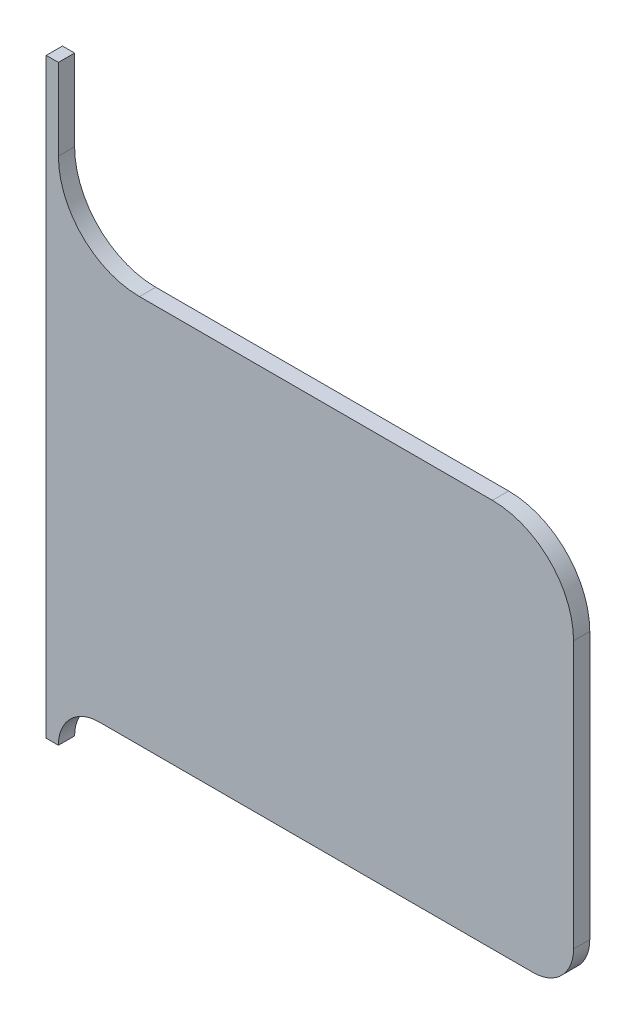
ISO-10303-21;
HEADER;
FILE_DESCRIPTION(('STEP AP214'),'2;1');
FILE_NAME('part.step','',(''),(''),'','','');
FILE_SCHEMA(('AUTOMOTIVE_DESIGN { 1 0 10303 214 1 1 1 1 }'));
ENDSEC;
DATA;
#1=APPLICATION_CONTEXT('core data for automotive mechanical design processes');
#2=APPLICATION_PROTOCOL_DEFINITION('international standard','automotive_design',2000,#1);
#3=PRODUCT_CONTEXT('',#1,'mechanical');
#4=PRODUCT('Part','Part','',(#3));
#5=PRODUCT_RELATED_PRODUCT_CATEGORY('part','',(#4));
#6=PRODUCT_DEFINITION_FORMATION('','',#4);
#7=PRODUCT_DEFINITION_CONTEXT('part definition',#1,'design');
#8=PRODUCT_DEFINITION('design','',#6,#7);
#9=PRODUCT_DEFINITION_SHAPE('','',#8);
#10=(LENGTH_UNIT() NAMED_UNIT(*) SI_UNIT(.MILLI.,.METRE.));
#11=(NAMED_UNIT(*) PLANE_ANGLE_UNIT() SI_UNIT($,.RADIAN.));
#12=(NAMED_UNIT(*) SI_UNIT($,.STERADIAN.) SOLID_ANGLE_UNIT());
#13=UNCERTAINTY_MEASURE_WITH_UNIT(LENGTH_MEASURE(1.E-05),#10,'distance_accuracy_value','');
#14=(GEOMETRIC_REPRESENTATION_CONTEXT(3) GLOBAL_UNCERTAINTY_ASSIGNED_CONTEXT((#13)) GLOBAL_UNIT_ASSIGNED_CONTEXT((#10,
#11,#12)) REPRESENTATION_CONTEXT('',''));
#15=CARTESIAN_POINT('',(0.,0.,0.));
#16=DIRECTION('',(0.,0.,1.));
#17=DIRECTION('',(1.,0.,0.));
#18=AXIS2_PLACEMENT_3D('',#15,#16,#17);
#19=CARTESIAN_POINT('',(0.,0.,128.));
#20=DIRECTION('',(0.,0.,-1.));
#21=DIRECTION('',(-1.,0.,0.));
#22=AXIS2_PLACEMENT_3D('',#19,#20,#21);
#23=PLANE('',#22);
#24=DIRECTION('',(0.,-1.,0.));
#25=VECTOR('',#24,1.);
#26=CARTESIAN_POINT('',(25.,40.,128.));
#27=LINE('',#26,#25);
#28=CARTESIAN_POINT('',(25.,30.,128.));
#29=VERTEX_POINT('',#28);
#30=CARTESIAN_POINT('',(25.,-2.90000000000001,128.));
#31=VERTEX_POINT('',#30);
#32=EDGE_CURVE('E186',#29,#31,#27,.T.);
#33=ORIENTED_EDGE('',*,*,#32,.T.);
#34=CARTESIAN_POINT('',(20.,-2.90000000000001,128.));
#35=DIRECTION('',(0.,0.,-1.));
#36=DIRECTION('',(-1.,0.,0.));
#37=AXIS2_PLACEMENT_3D('',#34,#35,#36);
#38=CIRCLE('',#37,5.);
#39=CARTESIAN_POINT('',(20.,-7.90000000000001,128.));
#40=VERTEX_POINT('',#39);
#41=EDGE_CURVE('E169',#31,#40,#38,.T.);
#42=ORIENTED_EDGE('',*,*,#41,.T.);
#43=DIRECTION('',(1.,0.,0.));
#44=VECTOR('',#43,1.);
#45=CARTESIAN_POINT('',(0.,-7.90000000000001,128.));
#46=LINE('',#45,#44);
#47=CARTESIAN_POINT('',(-33.5,-7.90000000000001,128.));
#48=VERTEX_POINT('',#47);
#49=EDGE_CURVE('E179',#48,#40,#46,.T.);
#50=ORIENTED_EDGE('',*,*,#49,.F.);
#51=CARTESIAN_POINT('',(-33.5,-12.9,128.));
#52=DIRECTION('',(0.,0.,-1.));
#53=DIRECTION('',(-1.,0.,0.));
#54=AXIS2_PLACEMENT_3D('',#51,#52,#53);
#55=CIRCLE('',#54,5.);
#56=CARTESIAN_POINT('',(-38.5,-12.9,128.));
#57=VERTEX_POINT('',#56);
#58=EDGE_CURVE('E11',#48,#57,#55,.F.);
#59=ORIENTED_EDGE('',*,*,#58,.T.);
#60=DIRECTION('',(1.,0.,0.));
#61=VECTOR('',#60,1.);
#62=CARTESIAN_POINT('',(0.,-12.9,128.));
#63=LINE('',#62,#61);
#64=CARTESIAN_POINT('',(-40.,-12.9,128.));
#65=VERTEX_POINT('',#64);
#66=EDGE_CURVE('E132',#65,#57,#63,.T.);
#67=ORIENTED_EDGE('',*,*,#66,.F.);
#68=DIRECTION('',(0.,1.,0.));
#69=VECTOR('',#68,1.);
#70=CARTESIAN_POINT('',(-40.,0.,128.));
#71=LINE('',#70,#69);
#72=CARTESIAN_POINT('',(-40.,60.,128.));
#73=VERTEX_POINT('',#72);
#74=EDGE_CURVE('E131',#65,#73,#71,.T.);
#75=ORIENTED_EDGE('',*,*,#74,.T.);
#76=DIRECTION('',(1.,0.,0.));
#77=VECTOR('',#76,1.);
#78=CARTESIAN_POINT('',(-40.,60.,128.));
#79=LINE('',#78,#77);
#80=CARTESIAN_POINT('',(-38.5,60.,128.));
#81=VERTEX_POINT('',#80);
#82=EDGE_CURVE('E212',#73,#81,#79,.T.);
#83=ORIENTED_EDGE('',*,*,#82,.T.);
#84=DIRECTION('',(0.,-1.,0.));
#85=VECTOR('',#84,1.);
#86=CARTESIAN_POINT('',(-38.5,60.,128.));
#87=LINE('',#86,#85);
#88=CARTESIAN_POINT('',(-38.5,50.0000000000001,128.));
#89=VERTEX_POINT('',#88);
#90=EDGE_CURVE('E219',#81,#89,#87,.T.);
#91=ORIENTED_EDGE('',*,*,#90,.T.);
#92=CARTESIAN_POINT('',(-28.5,50.,128.));
#93=DIRECTION('',(0.,0.,-1.));
#94=DIRECTION('',(-1.,0.,0.));
#95=AXIS2_PLACEMENT_3D('',#92,#93,#94);
#96=CIRCLE('',#95,10.);
#97=CARTESIAN_POINT('',(-28.4999999999999,40.,128.));
#98=VERTEX_POINT('',#97);
#99=EDGE_CURVE('E216',#89,#98,#96,.F.);
#100=ORIENTED_EDGE('',*,*,#99,.T.);
#101=DIRECTION('',(1.,0.,0.));
#102=VECTOR('',#101,1.);
#103=CARTESIAN_POINT('',(-28.4999999999999,40.,128.));
#104=LINE('',#103,#102);
#105=CARTESIAN_POINT('',(15.,40.,128.));
#106=VERTEX_POINT('',#105);
#107=EDGE_CURVE('E187',#98,#106,#104,.T.);
#108=ORIENTED_EDGE('',*,*,#107,.T.);
#109=CARTESIAN_POINT('',(15.,30.,128.));
#110=DIRECTION('',(0.,0.,-1.));
#111=DIRECTION('',(-1.,0.,0.));
#112=AXIS2_PLACEMENT_3D('',#109,#110,#111);
#113=CIRCLE('',#112,10.);
#114=EDGE_CURVE('E143',#29,#106,#113,.F.);
#115=ORIENTED_EDGE('',*,*,#114,.F.);
#116=EDGE_LOOP('',(#33,#42,#50,#59,#67,#75,#83,#91,#100,#108,#115));
#117=FACE_BOUND('',#116,.T.);
#118=ADVANCED_FACE('F32',(#117),#23,.T.);
#119=CARTESIAN_POINT('',(-40.,60.,130.));
#120=DIRECTION('',(0.,-1.,0.));
#121=DIRECTION('',(0.,0.,-1.));
#122=AXIS2_PLACEMENT_3D('',#119,#120,#121);
#123=PLANE('',#122);
#124=ORIENTED_EDGE('',*,*,#82,.F.);
#125=DIRECTION('',(0.,0.,-1.));
#126=VECTOR('',#125,1.);
#127=CARTESIAN_POINT('',(-40.,60.,130.));
#128=LINE('',#127,#126);
#129=CARTESIAN_POINT('',(-40.,60.,130.));
#130=VERTEX_POINT('',#129);
#131=EDGE_CURVE('E151',#130,#73,#128,.T.);
#132=ORIENTED_EDGE('',*,*,#131,.F.);
#133=DIRECTION('',(-1.,0.,0.));
#134=VECTOR('',#133,1.);
#135=CARTESIAN_POINT('',(-40.,60.,130.));
#136=LINE('',#135,#134);
#137=CARTESIAN_POINT('',(-38.5,60.,130.));
#138=VERTEX_POINT('',#137);
#139=EDGE_CURVE('E136',#138,#130,#136,.T.);
#140=ORIENTED_EDGE('',*,*,#139,.F.);
#141=DIRECTION('',(0.,0.,-1.));
#142=VECTOR('',#141,1.);
#143=CARTESIAN_POINT('',(-38.5,60.,130.));
#144=LINE('',#143,#142);
#145=EDGE_CURVE('E154',#138,#81,#144,.T.);
#146=ORIENTED_EDGE('',*,*,#145,.T.);
#147=EDGE_LOOP('',(#124,#132,#140,#146));
#148=FACE_BOUND('',#147,.T.);
#149=ADVANCED_FACE('F240',(#148),#123,.F.);
#150=CARTESIAN_POINT('',(-38.5,60.,130.));
#151=DIRECTION('',(-1.,0.,0.));
#152=DIRECTION('',(0.,0.,1.));
#153=AXIS2_PLACEMENT_3D('',#150,#151,#152);
#154=PLANE('',#153);
#155=ORIENTED_EDGE('',*,*,#90,.F.);
#156=ORIENTED_EDGE('',*,*,#145,.F.);
#157=DIRECTION('',(0.,1.,0.));
#158=VECTOR('',#157,1.);
#159=CARTESIAN_POINT('',(-38.5,60.,130.));
#160=LINE('',#159,#158);
#161=CARTESIAN_POINT('',(-38.5,50.0000000000001,130.));
#162=VERTEX_POINT('',#161);
#163=EDGE_CURVE('E148',#162,#138,#160,.T.);
#164=ORIENTED_EDGE('',*,*,#163,.F.);
#165=DIRECTION('',(0.,0.,-1.));
#166=VECTOR('',#165,1.);
#167=CARTESIAN_POINT('',(-38.5,50.0000000000001,130.));
#168=LINE('',#167,#166);
#169=EDGE_CURVE('E195',#162,#89,#168,.T.);
#170=ORIENTED_EDGE('',*,*,#169,.T.);
#171=EDGE_LOOP('',(#155,#156,#164,#170));
#172=FACE_BOUND('',#171,.T.);
#173=ADVANCED_FACE('F229',(#172),#154,.F.);
#174=CARTESIAN_POINT('',(-28.5,50.,130.));
#175=DIRECTION('',(0.,0.,-1.));
#176=DIRECTION('',(-1.,0.,0.));
#177=AXIS2_PLACEMENT_3D('',#174,#175,#176);
#178=CYLINDRICAL_SURFACE('',#177,10.);
#179=ORIENTED_EDGE('',*,*,#99,.F.);
#180=ORIENTED_EDGE('',*,*,#169,.F.);
#181=CARTESIAN_POINT('',(-28.5,50.,130.));
#182=DIRECTION('',(0.,0.,-1.));
#183=DIRECTION('',(-1.,0.,0.));
#184=AXIS2_PLACEMENT_3D('',#181,#182,#183);
#185=CIRCLE('',#184,10.);
#186=CARTESIAN_POINT('',(-28.4999999999999,40.,130.));
#187=VERTEX_POINT('',#186);
#188=EDGE_CURVE('E141',#187,#162,#185,.T.);
#189=ORIENTED_EDGE('',*,*,#188,.F.);
#190=DIRECTION('',(0.,0.,-1.));
#191=VECTOR('',#190,1.);
#192=CARTESIAN_POINT('',(-28.4999999999999,40.,130.));
#193=LINE('',#192,#191);
#194=EDGE_CURVE('E197',#187,#98,#193,.T.);
#195=ORIENTED_EDGE('',*,*,#194,.T.);
#196=EDGE_LOOP('',(#179,#180,#189,#195));
#197=FACE_BOUND('',#196,.T.);
#198=ADVANCED_FACE('F231',(#197),#178,.F.);
#199=CARTESIAN_POINT('',(-40.,0.,40.));
#200=DIRECTION('',(1.,0.,0.));
#201=DIRECTION('',(0.,0.,-1.));
#202=AXIS2_PLACEMENT_3D('',#199,#200,#201);
#203=PLANE('',#202);
#204=ORIENTED_EDGE('',*,*,#74,.F.);
#205=DIRECTION('',(0.,0.,1.));
#206=VECTOR('',#205,1.);
#207=CARTESIAN_POINT('',(-40.,-12.9,40.));
#208=LINE('',#207,#206);
#209=CARTESIAN_POINT('',(-40.,-12.9,130.));
#210=VERTEX_POINT('',#209);
#211=EDGE_CURVE('E119',#65,#210,#208,.T.);
#212=ORIENTED_EDGE('',*,*,#211,.T.);
#213=DIRECTION('',(0.,-1.,0.));
#214=VECTOR('',#213,1.);
#215=CARTESIAN_POINT('',(-40.,40.,130.));
#216=LINE('',#215,#214);
#217=EDGE_CURVE('E130',#130,#210,#216,.T.);
#218=ORIENTED_EDGE('',*,*,#217,.F.);
#219=ORIENTED_EDGE('',*,*,#131,.T.);
#220=EDGE_LOOP('',(#204,#212,#218,#219));
#221=FACE_BOUND('',#220,.T.);
#222=ADVANCED_FACE('F128',(#221),#203,.F.);
#223=CARTESIAN_POINT('',(-28.4999999999999,40.,130.));
#224=DIRECTION('',(0.,-1.,0.));
#225=DIRECTION('',(1.,0.,0.));
#226=AXIS2_PLACEMENT_3D('',#223,#224,#225);
#227=PLANE('',#226);
#228=ORIENTED_EDGE('',*,*,#107,.F.);
#229=ORIENTED_EDGE('',*,*,#194,.F.);
#230=DIRECTION('',(-1.,0.,0.));
#231=VECTOR('',#230,1.);
#232=CARTESIAN_POINT('',(-28.4999999999999,40.,130.));
#233=LINE('',#232,#231);
#234=CARTESIAN_POINT('',(15.,40.,130.));
#235=VERTEX_POINT('',#234);
#236=EDGE_CURVE('E138',#235,#187,#233,.T.);
#237=ORIENTED_EDGE('',*,*,#236,.F.);
#238=DIRECTION('',(0.,0.,-1.));
#239=VECTOR('',#238,1.);
#240=CARTESIAN_POINT('',(15.,40.,130.));
#241=LINE('',#240,#239);
#242=EDGE_CURVE('E198',#235,#106,#241,.T.);
#243=ORIENTED_EDGE('',*,*,#242,.T.);
#244=EDGE_LOOP('',(#228,#229,#237,#243));
#245=FACE_BOUND('',#244,.T.);
#246=ADVANCED_FACE('F209',(#245),#227,.F.);
#247=CARTESIAN_POINT('',(25.,40.,184.));
#248=DIRECTION('',(-1.,0.,0.));
#249=DIRECTION('',(0.,-1.,0.));
#250=AXIS2_PLACEMENT_3D('',#247,#248,#249);
#251=PLANE('',#250);
#252=DIRECTION('',(0.,1.,0.));
#253=VECTOR('',#252,1.);
#254=CARTESIAN_POINT('',(25.,50.,130.));
#255=LINE('',#254,#253);
#256=CARTESIAN_POINT('',(25.,-2.90000000000001,130.));
#257=VERTEX_POINT('',#256);
#258=CARTESIAN_POINT('',(25.,30.,130.));
#259=VERTEX_POINT('',#258);
#260=EDGE_CURVE('E139',#257,#259,#255,.T.);
#261=ORIENTED_EDGE('',*,*,#260,.F.);
#262=DIRECTION('',(0.,0.,1.));
#263=VECTOR('',#262,1.);
#264=CARTESIAN_POINT('',(25.,-2.90000000000001,184.));
#265=LINE('',#264,#263);
#266=EDGE_CURVE('E47',#257,#31,#265,.F.);
#267=ORIENTED_EDGE('',*,*,#266,.T.);
#268=ORIENTED_EDGE('',*,*,#32,.F.);
#269=DIRECTION('',(0.,0.,-1.));
#270=VECTOR('',#269,1.);
#271=CARTESIAN_POINT('',(25.,30.,184.));
#272=LINE('',#271,#270);
#273=EDGE_CURVE('E160',#29,#259,#272,.F.);
#274=ORIENTED_EDGE('',*,*,#273,.T.);
#275=EDGE_LOOP('',(#261,#267,#268,#274));
#276=FACE_BOUND('',#275,.T.);
#277=ADVANCED_FACE('F265',(#276),#251,.F.);
#278=CARTESIAN_POINT('',(15.,30.,130.));
#279=DIRECTION('',(0.,0.,-1.));
#280=DIRECTION('',(-1.,0.,0.));
#281=AXIS2_PLACEMENT_3D('',#278,#279,#280);
#282=CYLINDRICAL_SURFACE('',#281,10.);
#283=ORIENTED_EDGE('',*,*,#273,.F.);
#284=ORIENTED_EDGE('',*,*,#114,.T.);
#285=ORIENTED_EDGE('',*,*,#242,.F.);
#286=CARTESIAN_POINT('',(15.,30.,130.));
#287=DIRECTION('',(0.,0.,-1.));
#288=DIRECTION('',(-1.,0.,0.));
#289=AXIS2_PLACEMENT_3D('',#286,#287,#288);
#290=CIRCLE('',#289,10.);
#291=EDGE_CURVE('E155',#259,#235,#290,.F.);
#292=ORIENTED_EDGE('',*,*,#291,.F.);
#293=EDGE_LOOP('',(#283,#284,#285,#292));
#294=FACE_BOUND('',#293,.T.);
#295=ADVANCED_FACE('F211',(#294),#282,.T.);
#296=CARTESIAN_POINT('',(-28.5,50.,130.));
#297=DIRECTION('',(0.,0.,-1.));
#298=DIRECTION('',(-1.,0.,0.));
#299=AXIS2_PLACEMENT_3D('',#296,#297,#298);
#300=PLANE('',#299);
#301=DIRECTION('',(-1.,0.,0.));
#302=VECTOR('',#301,1.);
#303=CARTESIAN_POINT('',(-38.5,-7.90000000000001,130.));
#304=LINE('',#303,#302);
#305=CARTESIAN_POINT('',(20.,-7.90000000000001,130.));
#306=VERTEX_POINT('',#305);
#307=CARTESIAN_POINT('',(-33.5,-7.90000000000001,130.));
#308=VERTEX_POINT('',#307);
#309=EDGE_CURVE('E171',#306,#308,#304,.T.);
#310=ORIENTED_EDGE('',*,*,#309,.F.);
#311=CARTESIAN_POINT('',(20.,-2.90000000000001,130.));
#312=DIRECTION('',(0.,0.,-1.));
#313=DIRECTION('',(-1.,0.,0.));
#314=AXIS2_PLACEMENT_3D('',#311,#312,#313);
#315=CIRCLE('',#314,5.);
#316=EDGE_CURVE('E55',#306,#257,#315,.F.);
#317=ORIENTED_EDGE('',*,*,#316,.T.);
#318=ORIENTED_EDGE('',*,*,#260,.T.);
#319=ORIENTED_EDGE('',*,*,#291,.T.);
#320=ORIENTED_EDGE('',*,*,#236,.T.);
#321=ORIENTED_EDGE('',*,*,#188,.T.);
#322=ORIENTED_EDGE('',*,*,#163,.T.);
#323=ORIENTED_EDGE('',*,*,#139,.T.);
#324=ORIENTED_EDGE('',*,*,#217,.T.);
#325=DIRECTION('',(-1.,0.,0.));
#326=VECTOR('',#325,1.);
#327=CARTESIAN_POINT('',(-38.5,-12.9,130.));
#328=LINE('',#327,#326);
#329=CARTESIAN_POINT('',(-38.5,-12.9,130.));
#330=VERTEX_POINT('',#329);
#331=EDGE_CURVE('E115',#330,#210,#328,.T.);
#332=ORIENTED_EDGE('',*,*,#331,.F.);
#333=CARTESIAN_POINT('',(-33.5,-12.9,130.));
#334=DIRECTION('',(0.,0.,-1.));
#335=DIRECTION('',(-1.,0.,0.));
#336=AXIS2_PLACEMENT_3D('',#333,#334,#335);
#337=CIRCLE('',#336,5.);
#338=EDGE_CURVE('E40',#330,#308,#337,.T.);
#339=ORIENTED_EDGE('',*,*,#338,.T.);
#340=EDGE_LOOP('',(#310,#317,#318,#319,#320,#321,#322,#323,#324,#332,#339));
#341=FACE_BOUND('',#340,.T.);
#342=ADVANCED_FACE('F134',(#341),#300,.F.);
#343=CARTESIAN_POINT('',(-38.5,-7.90000000000001,120.));
#344=DIRECTION('',(0.,1.,0.));
#345=DIRECTION('',(0.,0.,1.));
#346=AXIS2_PLACEMENT_3D('',#343,#344,#345);
#347=PLANE('',#346);
#348=ORIENTED_EDGE('',*,*,#309,.T.);
#349=DIRECTION('',(0.,0.,1.));
#350=VECTOR('',#349,1.);
#351=CARTESIAN_POINT('',(-33.5,-7.90000000000001,128.));
#352=LINE('',#351,#350);
#353=EDGE_CURVE('E165',#308,#48,#352,.F.);
#354=ORIENTED_EDGE('',*,*,#353,.T.);
#355=ORIENTED_EDGE('',*,*,#49,.T.);
#356=DIRECTION('',(0.,0.,1.));
#357=VECTOR('',#356,1.);
#358=CARTESIAN_POINT('',(20.,-7.90000000000001,120.));
#359=LINE('',#358,#357);
#360=EDGE_CURVE('E162',#40,#306,#359,.T.);
#361=ORIENTED_EDGE('',*,*,#360,.T.);
#362=EDGE_LOOP('',(#348,#354,#355,#361));
#363=FACE_BOUND('',#362,.T.);
#364=ADVANCED_FACE('F175',(#363),#347,.F.);
#365=CARTESIAN_POINT('',(-38.5,-12.9,120.));
#366=DIRECTION('',(0.,1.,0.));
#367=DIRECTION('',(-1.,0.,0.));
#368=AXIS2_PLACEMENT_3D('',#365,#366,#367);
#369=PLANE('',#368);
#370=ORIENTED_EDGE('',*,*,#66,.T.);
#371=DIRECTION('',(0.,0.,1.));
#372=VECTOR('',#371,1.);
#373=CARTESIAN_POINT('',(-38.5,-12.9,120.));
#374=LINE('',#373,#372);
#375=EDGE_CURVE('E122',#57,#330,#374,.T.);
#376=ORIENTED_EDGE('',*,*,#375,.T.);
#377=ORIENTED_EDGE('',*,*,#331,.T.);
#378=ORIENTED_EDGE('',*,*,#211,.F.);
#379=EDGE_LOOP('',(#370,#376,#377,#378));
#380=FACE_BOUND('',#379,.T.);
#381=ADVANCED_FACE('F118',(#380),#369,.F.);
#382=CARTESIAN_POINT('',(-33.5,-12.9,130.));
#383=DIRECTION('',(0.,0.,-1.));
#384=DIRECTION('',(-1.,0.,0.));
#385=AXIS2_PLACEMENT_3D('',#382,#383,#384);
#386=CYLINDRICAL_SURFACE('',#385,5.);
#387=ORIENTED_EDGE('',*,*,#58,.F.);
#388=ORIENTED_EDGE('',*,*,#353,.F.);
#389=ORIENTED_EDGE('',*,*,#338,.F.);
#390=ORIENTED_EDGE('',*,*,#375,.F.);
#391=EDGE_LOOP('',(#387,#388,#389,#390));
#392=FACE_BOUND('',#391,.T.);
#393=ADVANCED_FACE('F182',(#392),#386,.F.);
#394=CARTESIAN_POINT('',(20.,-2.90000000000001,120.));
#395=DIRECTION('',(0.,0.,1.));
#396=DIRECTION('',(1.,0.,0.));
#397=AXIS2_PLACEMENT_3D('',#394,#395,#396);
#398=CYLINDRICAL_SURFACE('',#397,5.);
#399=ORIENTED_EDGE('',*,*,#41,.F.);
#400=ORIENTED_EDGE('',*,*,#266,.F.);
#401=ORIENTED_EDGE('',*,*,#316,.F.);
#402=ORIENTED_EDGE('',*,*,#360,.F.);
#403=EDGE_LOOP('',(#399,#400,#401,#402));
#404=FACE_BOUND('',#403,.T.);
#405=ADVANCED_FACE('F34',(#404),#398,.T.);
#406=CLOSED_SHELL('',(#118,#149,#173,#198,#222,#246,#277,#295,#342,#364,#381,#393,#405));
#407=MANIFOLD_SOLID_BREP('B2',#406);
#408=ADVANCED_BREP_SHAPE_REPRESENTATION('',(#18,#407),#14);
#409=SHAPE_DEFINITION_REPRESENTATION(#9,#408);
ENDSEC;
END-ISO-10303-21;
